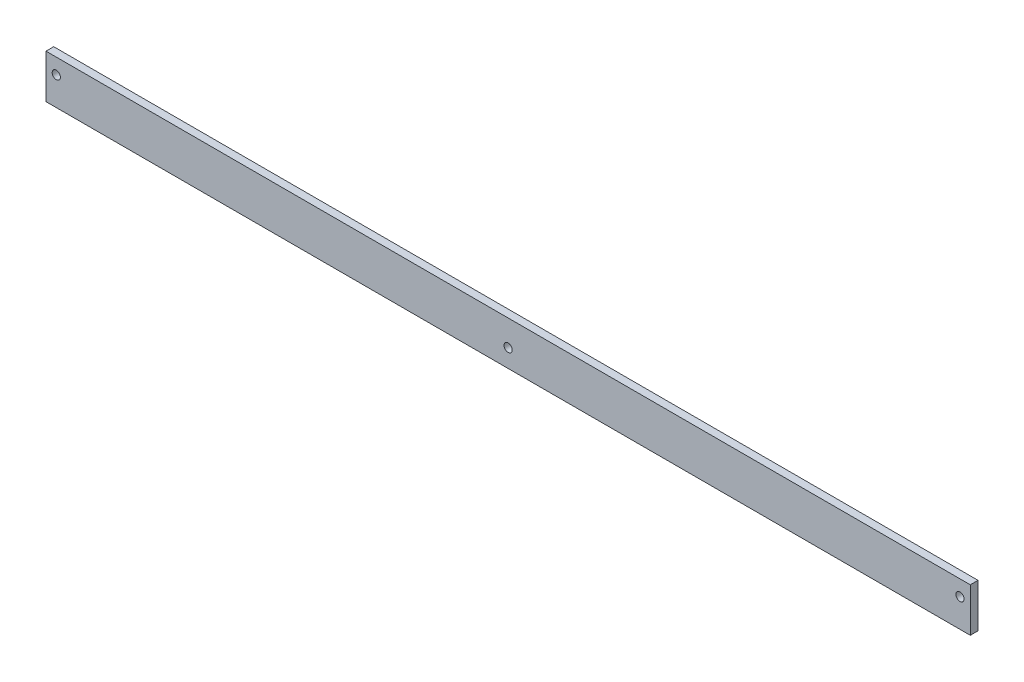
ISO-10303-21;
HEADER;
FILE_DESCRIPTION(('STEP AP214'),'2;1');
FILE_NAME('part.step','',(''),(''),'','','');
FILE_SCHEMA(('AUTOMOTIVE_DESIGN { 1 0 10303 214 1 1 1 1 }'));
ENDSEC;
DATA;
#1=APPLICATION_CONTEXT('core data for automotive mechanical design processes');
#2=APPLICATION_PROTOCOL_DEFINITION('international standard','automotive_design',2000,#1);
#3=PRODUCT_CONTEXT('',#1,'mechanical');
#4=PRODUCT('Part','Part','',(#3));
#5=PRODUCT_RELATED_PRODUCT_CATEGORY('part','',(#4));
#6=PRODUCT_DEFINITION_FORMATION('','',#4);
#7=PRODUCT_DEFINITION_CONTEXT('part definition',#1,'design');
#8=PRODUCT_DEFINITION('design','',#6,#7);
#9=PRODUCT_DEFINITION_SHAPE('','',#8);
#10=(LENGTH_UNIT() NAMED_UNIT(*) SI_UNIT(.MILLI.,.METRE.));
#11=(NAMED_UNIT(*) PLANE_ANGLE_UNIT() SI_UNIT($,.RADIAN.));
#12=(NAMED_UNIT(*) SI_UNIT($,.STERADIAN.) SOLID_ANGLE_UNIT());
#13=UNCERTAINTY_MEASURE_WITH_UNIT(LENGTH_MEASURE(1.E-05),#10,'distance_accuracy_value','');
#14=(GEOMETRIC_REPRESENTATION_CONTEXT(3) GLOBAL_UNCERTAINTY_ASSIGNED_CONTEXT((#13)) GLOBAL_UNIT_ASSIGNED_CONTEXT((#10,
#11,#12)) REPRESENTATION_CONTEXT('',''));
#15=CARTESIAN_POINT('',(0.,0.,0.));
#16=DIRECTION('',(0.,0.,1.));
#17=DIRECTION('',(1.,0.,0.));
#18=AXIS2_PLACEMENT_3D('',#15,#16,#17);
#19=CARTESIAN_POINT('',(-99.5000000000003,-8.5,3.));
#20=DIRECTION('',(1.,0.,0.));
#21=DIRECTION('',(0.,1.,0.));
#22=AXIS2_PLACEMENT_3D('',#19,#20,#21);
#23=PLANE('',#22);
#24=DIRECTION('',(0.,-1.,0.));
#25=VECTOR('',#24,1.);
#26=CARTESIAN_POINT('',(-99.5000000000003,-8.5,0.));
#27=LINE('',#26,#25);
#28=CARTESIAN_POINT('',(-99.5000000000003,8.5,0.));
#29=VERTEX_POINT('',#28);
#30=CARTESIAN_POINT('',(-99.5000000000003,-8.5,0.));
#31=VERTEX_POINT('',#30);
#32=EDGE_CURVE('E96',#29,#31,#27,.T.);
#33=ORIENTED_EDGE('',*,*,#32,.T.);
#34=DIRECTION('',(0.,0.,-1.));
#35=VECTOR('',#34,1.);
#36=CARTESIAN_POINT('',(-99.5000000000003,-8.5,3.));
#37=LINE('',#36,#35);
#38=CARTESIAN_POINT('',(-99.5000000000003,-8.5,3.));
#39=VERTEX_POINT('',#38);
#40=EDGE_CURVE('E11',#39,#31,#37,.T.);
#41=ORIENTED_EDGE('',*,*,#40,.F.);
#42=DIRECTION('',(0.,-1.,0.));
#43=VECTOR('',#42,1.);
#44=CARTESIAN_POINT('',(-99.5000000000003,-8.5,3.));
#45=LINE('',#44,#43);
#46=CARTESIAN_POINT('',(-99.5000000000003,8.5,3.));
#47=VERTEX_POINT('',#46);
#48=EDGE_CURVE('E84',#47,#39,#45,.T.);
#49=ORIENTED_EDGE('',*,*,#48,.F.);
#50=DIRECTION('',(0.,0.,-1.));
#51=VECTOR('',#50,1.);
#52=CARTESIAN_POINT('',(-99.5000000000003,8.5,3.));
#53=LINE('',#52,#51);
#54=EDGE_CURVE('E92',#47,#29,#53,.T.);
#55=ORIENTED_EDGE('',*,*,#54,.T.);
#56=EDGE_LOOP('',(#33,#41,#49,#55));
#57=FACE_BOUND('',#56,.T.);
#58=ADVANCED_FACE('F33',(#57),#23,.F.);
#59=CARTESIAN_POINT('',(259.5,-8.49999999999996,3.));
#60=DIRECTION('',(0.,1.,0.));
#61=DIRECTION('',(-1.,0.,0.));
#62=AXIS2_PLACEMENT_3D('',#59,#60,#61);
#63=PLANE('',#62);
#64=DIRECTION('',(1.,0.,0.));
#65=VECTOR('',#64,1.);
#66=CARTESIAN_POINT('',(259.5,-8.49999999999996,0.));
#67=LINE('',#66,#65);
#68=CARTESIAN_POINT('',(259.5,-8.49999999999996,0.));
#69=VERTEX_POINT('',#68);
#70=EDGE_CURVE('E88',#31,#69,#67,.T.);
#71=ORIENTED_EDGE('',*,*,#70,.T.);
#72=DIRECTION('',(0.,0.,-1.));
#73=VECTOR('',#72,1.);
#74=CARTESIAN_POINT('',(259.5,-8.49999999999996,3.));
#75=LINE('',#74,#73);
#76=CARTESIAN_POINT('',(259.5,-8.49999999999996,3.));
#77=VERTEX_POINT('',#76);
#78=EDGE_CURVE('E41',#77,#69,#75,.T.);
#79=ORIENTED_EDGE('',*,*,#78,.F.);
#80=DIRECTION('',(1.,0.,0.));
#81=VECTOR('',#80,1.);
#82=CARTESIAN_POINT('',(259.5,-8.49999999999996,3.));
#83=LINE('',#82,#81);
#84=EDGE_CURVE('E79',#39,#77,#83,.T.);
#85=ORIENTED_EDGE('',*,*,#84,.F.);
#86=ORIENTED_EDGE('',*,*,#40,.T.);
#87=EDGE_LOOP('',(#71,#79,#85,#86));
#88=FACE_BOUND('',#87,.T.);
#89=ADVANCED_FACE('F87',(#88),#63,.F.);
#90=CARTESIAN_POINT('',(259.5,-8.49999999999996,3.));
#91=DIRECTION('',(-1.,0.,0.));
#92=DIRECTION('',(0.,0.,1.));
#93=AXIS2_PLACEMENT_3D('',#90,#91,#92);
#94=PLANE('',#93);
#95=DIRECTION('',(0.,1.,0.));
#96=VECTOR('',#95,1.);
#97=CARTESIAN_POINT('',(259.5,-8.49999999999996,0.));
#98=LINE('',#97,#96);
#99=CARTESIAN_POINT('',(259.5,8.50000000000004,0.));
#100=VERTEX_POINT('',#99);
#101=EDGE_CURVE('E66',#69,#100,#98,.T.);
#102=ORIENTED_EDGE('',*,*,#101,.T.);
#103=DIRECTION('',(0.,0.,-1.));
#104=VECTOR('',#103,1.);
#105=CARTESIAN_POINT('',(259.5,8.50000000000004,3.));
#106=LINE('',#105,#104);
#107=CARTESIAN_POINT('',(259.5,8.50000000000004,3.));
#108=VERTEX_POINT('',#107);
#109=EDGE_CURVE('E89',#108,#100,#106,.T.);
#110=ORIENTED_EDGE('',*,*,#109,.F.);
#111=DIRECTION('',(0.,1.,0.));
#112=VECTOR('',#111,1.);
#113=CARTESIAN_POINT('',(259.5,-8.49999999999996,3.));
#114=LINE('',#113,#112);
#115=EDGE_CURVE('E82',#77,#108,#114,.T.);
#116=ORIENTED_EDGE('',*,*,#115,.F.);
#117=ORIENTED_EDGE('',*,*,#78,.T.);
#118=EDGE_LOOP('',(#102,#110,#116,#117));
#119=FACE_BOUND('',#118,.T.);
#120=ADVANCED_FACE('F90',(#119),#94,.F.);
#121=CARTESIAN_POINT('',(259.5,8.50000000000004,3.));
#122=DIRECTION('',(0.,-1.,0.));
#123=DIRECTION('',(1.,0.,0.));
#124=AXIS2_PLACEMENT_3D('',#121,#122,#123);
#125=PLANE('',#124);
#126=DIRECTION('',(-1.,0.,0.));
#127=VECTOR('',#126,1.);
#128=CARTESIAN_POINT('',(259.5,8.50000000000004,0.));
#129=LINE('',#128,#127);
#130=EDGE_CURVE('E72',#100,#29,#129,.T.);
#131=ORIENTED_EDGE('',*,*,#130,.T.);
#132=ORIENTED_EDGE('',*,*,#54,.F.);
#133=DIRECTION('',(-1.,0.,0.));
#134=VECTOR('',#133,1.);
#135=CARTESIAN_POINT('',(259.5,8.50000000000004,3.));
#136=LINE('',#135,#134);
#137=EDGE_CURVE('E49',#108,#47,#136,.T.);
#138=ORIENTED_EDGE('',*,*,#137,.F.);
#139=ORIENTED_EDGE('',*,*,#109,.T.);
#140=EDGE_LOOP('',(#131,#132,#138,#139));
#141=FACE_BOUND('',#140,.T.);
#142=ADVANCED_FACE('F104',(#141),#125,.F.);
#143=CARTESIAN_POINT('',(0.,0.,3.));
#144=DIRECTION('',(0.,0.,1.));
#145=DIRECTION('',(1.,0.,0.));
#146=AXIS2_PLACEMENT_3D('',#143,#144,#145);
#147=PLANE('',#146);
#148=CARTESIAN_POINT('',(79.9999999999997,-1.49999999999992,3.));
#149=DIRECTION('',(0.,0.,-1.));
#150=DIRECTION('',(-1.,0.,0.));
#151=AXIS2_PLACEMENT_3D('',#148,#149,#150);
#152=CIRCLE('',#151,1.60000000000001);
#153=CARTESIAN_POINT('',(78.3999999999997,-1.49999999999992,3.));
#154=VERTEX_POINT('',#153);
#155=EDGE_CURVE('E119',#154,#154,#152,.T.);
#156=ORIENTED_EDGE('',*,*,#155,.T.);
#157=EDGE_LOOP('',(#156));
#158=FACE_BOUND('',#157,.T.);
#159=CARTESIAN_POINT('',(255.5,2.50000000000005,3.));
#160=DIRECTION('',(0.,0.,-1.));
#161=DIRECTION('',(-1.,0.,0.));
#162=AXIS2_PLACEMENT_3D('',#159,#160,#161);
#163=CIRCLE('',#162,1.59999999999996);
#164=CARTESIAN_POINT('',(253.9,2.50000000000005,3.));
#165=VERTEX_POINT('',#164);
#166=EDGE_CURVE('E113',#165,#165,#163,.T.);
#167=ORIENTED_EDGE('',*,*,#166,.T.);
#168=EDGE_LOOP('',(#167));
#169=FACE_BOUND('',#168,.T.);
#170=CARTESIAN_POINT('',(-95.5000000000005,2.49999999999998,3.));
#171=DIRECTION('',(0.,0.,-1.));
#172=DIRECTION('',(-1.,0.,0.));
#173=AXIS2_PLACEMENT_3D('',#170,#171,#172);
#174=CIRCLE('',#173,1.60000000000001);
#175=CARTESIAN_POINT('',(-97.1000000000005,2.49999999999998,3.));
#176=VERTEX_POINT('',#175);
#177=EDGE_CURVE('E99',#176,#176,#174,.T.);
#178=ORIENTED_EDGE('',*,*,#177,.T.);
#179=EDGE_LOOP('',(#178));
#180=FACE_BOUND('',#179,.T.);
#181=ORIENTED_EDGE('',*,*,#48,.T.);
#182=ORIENTED_EDGE('',*,*,#84,.T.);
#183=ORIENTED_EDGE('',*,*,#115,.T.);
#184=ORIENTED_EDGE('',*,*,#137,.T.);
#185=EDGE_LOOP('',(#181,#182,#183,#184));
#186=FACE_BOUND('',#185,.T.);
#187=ADVANCED_FACE('F80',(#158,#169,#180,#186),#147,.T.);
#188=CARTESIAN_POINT('',(0.,0.,0.));
#189=DIRECTION('',(0.,0.,1.));
#190=DIRECTION('',(1.,0.,0.));
#191=AXIS2_PLACEMENT_3D('',#188,#189,#190);
#192=PLANE('',#191);
#193=CARTESIAN_POINT('',(79.9999999999997,-1.49999999999992,0.));
#194=DIRECTION('',(0.,0.,-1.));
#195=DIRECTION('',(-1.,0.,0.));
#196=AXIS2_PLACEMENT_3D('',#193,#194,#195);
#197=CIRCLE('',#196,1.60000000000001);
#198=CARTESIAN_POINT('',(78.3999999999997,-1.49999999999992,0.));
#199=VERTEX_POINT('',#198);
#200=EDGE_CURVE('E122',#199,#199,#197,.T.);
#201=ORIENTED_EDGE('',*,*,#200,.F.);
#202=EDGE_LOOP('',(#201));
#203=FACE_BOUND('',#202,.T.);
#204=CARTESIAN_POINT('',(255.5,2.50000000000005,0.));
#205=DIRECTION('',(0.,0.,-1.));
#206=DIRECTION('',(-1.,0.,0.));
#207=AXIS2_PLACEMENT_3D('',#204,#205,#206);
#208=CIRCLE('',#207,1.59999999999996);
#209=CARTESIAN_POINT('',(253.9,2.50000000000005,0.));
#210=VERTEX_POINT('',#209);
#211=EDGE_CURVE('E116',#210,#210,#208,.T.);
#212=ORIENTED_EDGE('',*,*,#211,.F.);
#213=EDGE_LOOP('',(#212));
#214=FACE_BOUND('',#213,.T.);
#215=CARTESIAN_POINT('',(-95.5000000000005,2.49999999999998,0.));
#216=DIRECTION('',(0.,0.,-1.));
#217=DIRECTION('',(-1.,0.,0.));
#218=AXIS2_PLACEMENT_3D('',#215,#216,#217);
#219=CIRCLE('',#218,1.60000000000001);
#220=CARTESIAN_POINT('',(-97.1000000000005,2.49999999999998,0.));
#221=VERTEX_POINT('',#220);
#222=EDGE_CURVE('E110',#221,#221,#219,.T.);
#223=ORIENTED_EDGE('',*,*,#222,.F.);
#224=EDGE_LOOP('',(#223));
#225=FACE_BOUND('',#224,.T.);
#226=ORIENTED_EDGE('',*,*,#32,.F.);
#227=ORIENTED_EDGE('',*,*,#130,.F.);
#228=ORIENTED_EDGE('',*,*,#101,.F.);
#229=ORIENTED_EDGE('',*,*,#70,.F.);
#230=EDGE_LOOP('',(#226,#227,#228,#229));
#231=FACE_BOUND('',#230,.T.);
#232=ADVANCED_FACE('F107',(#203,#214,#225,#231),#192,.F.);
#233=CARTESIAN_POINT('',(-95.5000000000005,2.49999999999998,3.));
#234=DIRECTION('',(0.,0.,-1.));
#235=DIRECTION('',(-1.,0.,0.));
#236=AXIS2_PLACEMENT_3D('',#233,#234,#235);
#237=CYLINDRICAL_SURFACE('',#236,1.60000000000001);
#238=ORIENTED_EDGE('',*,*,#177,.F.);
#239=EDGE_LOOP('',(#238));
#240=FACE_BOUND('',#239,.T.);
#241=ORIENTED_EDGE('',*,*,#222,.T.);
#242=EDGE_LOOP('',(#241));
#243=FACE_BOUND('',#242,.T.);
#244=ADVANCED_FACE('F139',(#240,#243),#237,.F.);
#245=CARTESIAN_POINT('',(255.5,2.50000000000005,3.));
#246=DIRECTION('',(0.,0.,-1.));
#247=DIRECTION('',(-1.,0.,0.));
#248=AXIS2_PLACEMENT_3D('',#245,#246,#247);
#249=CYLINDRICAL_SURFACE('',#248,1.59999999999996);
#250=ORIENTED_EDGE('',*,*,#166,.F.);
#251=EDGE_LOOP('',(#250));
#252=FACE_BOUND('',#251,.T.);
#253=ORIENTED_EDGE('',*,*,#211,.T.);
#254=EDGE_LOOP('',(#253));
#255=FACE_BOUND('',#254,.T.);
#256=ADVANCED_FACE('F133',(#252,#255),#249,.F.);
#257=CARTESIAN_POINT('',(79.9999999999997,-1.49999999999992,3.));
#258=DIRECTION('',(0.,0.,-1.));
#259=DIRECTION('',(-1.,0.,0.));
#260=AXIS2_PLACEMENT_3D('',#257,#258,#259);
#261=CYLINDRICAL_SURFACE('',#260,1.60000000000001);
#262=ORIENTED_EDGE('',*,*,#155,.F.);
#263=EDGE_LOOP('',(#262));
#264=FACE_BOUND('',#263,.T.);
#265=ORIENTED_EDGE('',*,*,#200,.T.);
#266=EDGE_LOOP('',(#265));
#267=FACE_BOUND('',#266,.T.);
#268=ADVANCED_FACE('F130',(#264,#267),#261,.F.);
#269=CLOSED_SHELL('',(#58,#89,#120,#142,#187,#232,#244,#256,#268));
#270=MANIFOLD_SOLID_BREP('B2',#269);
#271=ADVANCED_BREP_SHAPE_REPRESENTATION('',(#18,#270),#14);
#272=SHAPE_DEFINITION_REPRESENTATION(#9,#271);
ENDSEC;
END-ISO-10303-21;
